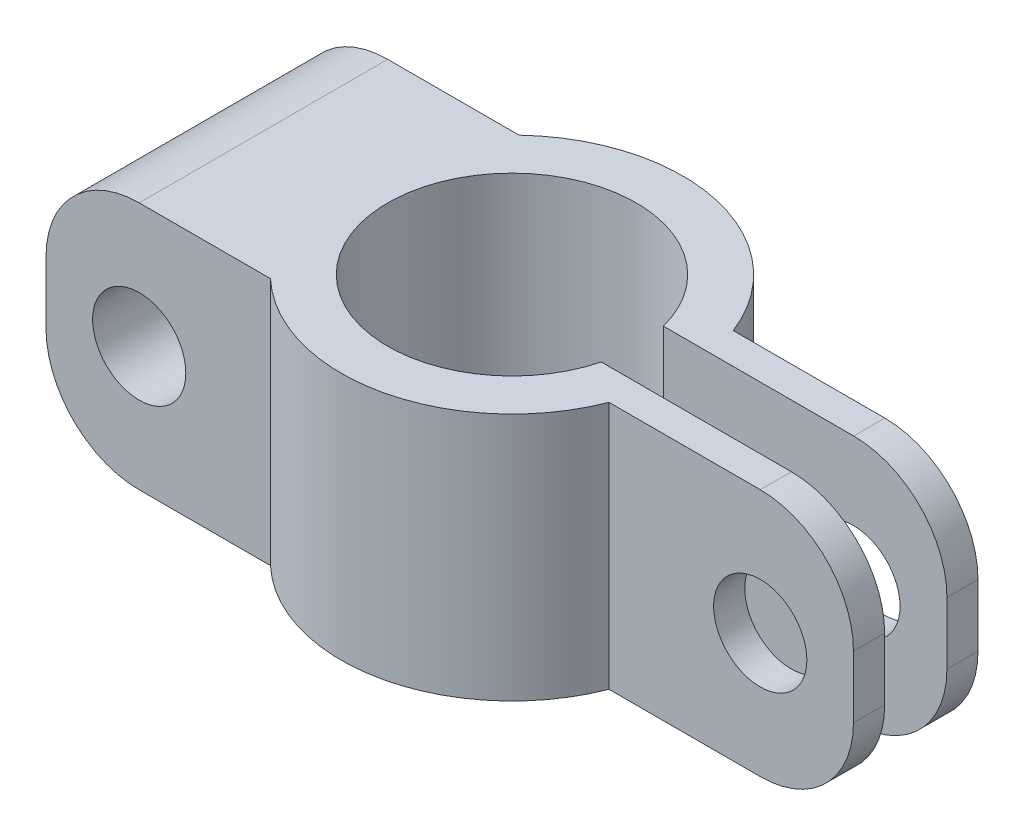
ISO-10303-21;
HEADER;
FILE_DESCRIPTION(('STEP AP214'),'2;1');
FILE_NAME('part.step','',(''),(''),'','','');
FILE_SCHEMA(('AUTOMOTIVE_DESIGN { 1 0 10303 214 1 1 1 1 }'));
ENDSEC;
DATA;
#1=APPLICATION_CONTEXT('core data for automotive mechanical design processes');
#2=APPLICATION_PROTOCOL_DEFINITION('international standard','automotive_design',2000,#1);
#3=PRODUCT_CONTEXT('',#1,'mechanical');
#4=PRODUCT('Part','Part','',(#3));
#5=PRODUCT_RELATED_PRODUCT_CATEGORY('part','',(#4));
#6=PRODUCT_DEFINITION_FORMATION('','',#4);
#7=PRODUCT_DEFINITION_CONTEXT('part definition',#1,'design');
#8=PRODUCT_DEFINITION('design','',#6,#7);
#9=PRODUCT_DEFINITION_SHAPE('','',#8);
#10=(LENGTH_UNIT() NAMED_UNIT(*) SI_UNIT(.MILLI.,.METRE.));
#11=(NAMED_UNIT(*) PLANE_ANGLE_UNIT() SI_UNIT($,.RADIAN.));
#12=(NAMED_UNIT(*) SI_UNIT($,.STERADIAN.) SOLID_ANGLE_UNIT());
#13=UNCERTAINTY_MEASURE_WITH_UNIT(LENGTH_MEASURE(1.E-05),#10,'distance_accuracy_value','');
#14=(GEOMETRIC_REPRESENTATION_CONTEXT(3) GLOBAL_UNCERTAINTY_ASSIGNED_CONTEXT((#13)) GLOBAL_UNIT_ASSIGNED_CONTEXT((#10,
#11,#12)) REPRESENTATION_CONTEXT('',''));
#15=CARTESIAN_POINT('',(0.,0.,0.));
#16=DIRECTION('',(0.,0.,1.));
#17=DIRECTION('',(1.,0.,0.));
#18=AXIS2_PLACEMENT_3D('',#15,#16,#17);
#19=CARTESIAN_POINT('',(0.,8.,0.));
#20=DIRECTION('',(0.,-1.,0.));
#21=DIRECTION('',(0.,0.,-1.));
#22=AXIS2_PLACEMENT_3D('',#19,#20,#21);
#23=CYLINDRICAL_SURFACE('',#22,5.5);
#24=CARTESIAN_POINT('',(0.,0.,0.));
#25=DIRECTION('',(0.,1.,0.));
#26=DIRECTION('',(0.,0.,1.));
#27=AXIS2_PLACEMENT_3D('',#24,#25,#26);
#28=CIRCLE('',#27,5.5);
#29=CARTESIAN_POINT('',(5.1234753829798,0.,-2.));
#30=VERTEX_POINT('',#29);
#31=CARTESIAN_POINT('',(-3.77491721763537,0.,-4.));
#32=VERTEX_POINT('',#31);
#33=EDGE_CURVE('E197',#30,#32,#28,.T.);
#34=ORIENTED_EDGE('',*,*,#33,.T.);
#35=DIRECTION('',(0.,-1.,0.));
#36=VECTOR('',#35,1.);
#37=CARTESIAN_POINT('',(-3.77491721763537,8.,-4.));
#38=LINE('',#37,#36);
#39=CARTESIAN_POINT('',(-3.77491721763537,8.,-4.));
#40=VERTEX_POINT('',#39);
#41=EDGE_CURVE('E174',#40,#32,#38,.T.);
#42=ORIENTED_EDGE('',*,*,#41,.F.);
#43=CARTESIAN_POINT('',(0.,8.,0.));
#44=DIRECTION('',(0.,1.,0.));
#45=DIRECTION('',(0.,0.,1.));
#46=AXIS2_PLACEMENT_3D('',#43,#44,#45);
#47=CIRCLE('',#46,5.5);
#48=CARTESIAN_POINT('',(5.1234753829798,8.,-2.));
#49=VERTEX_POINT('',#48);
#50=EDGE_CURVE('E183',#49,#40,#47,.T.);
#51=ORIENTED_EDGE('',*,*,#50,.F.);
#52=DIRECTION('',(0.,-1.,0.));
#53=VECTOR('',#52,1.);
#54=CARTESIAN_POINT('',(5.1234753829798,8.,-2.));
#55=LINE('',#54,#53);
#56=EDGE_CURVE('E263',#49,#30,#55,.T.);
#57=ORIENTED_EDGE('',*,*,#56,.T.);
#58=EDGE_LOOP('',(#34,#42,#51,#57));
#59=FACE_BOUND('',#58,.T.);
#60=ADVANCED_FACE('F45',(#59),#23,.T.);
#61=CARTESIAN_POINT('',(-3.77491721763537,8.,-4.));
#62=DIRECTION('',(0.,0.,1.));
#63=DIRECTION('',(1.,0.,0.));
#64=AXIS2_PLACEMENT_3D('',#61,#62,#63);
#65=PLANE('',#64);
#66=CARTESIAN_POINT('',(-8.,4.,-4.));
#67=DIRECTION('',(0.,0.,1.));
#68=DIRECTION('',(1.,0.,0.));
#69=AXIS2_PLACEMENT_3D('',#66,#67,#68);
#70=CIRCLE('',#69,1.5);
#71=CARTESIAN_POINT('',(-6.5,4.,-4.));
#72=VERTEX_POINT('',#71);
#73=EDGE_CURVE('E316',#72,#72,#70,.T.);
#74=ORIENTED_EDGE('',*,*,#73,.T.);
#75=EDGE_LOOP('',(#74));
#76=FACE_BOUND('',#75,.T.);
#77=DIRECTION('',(-1.,0.,0.));
#78=VECTOR('',#77,1.);
#79=CARTESIAN_POINT('',(-3.77491721763537,0.,-4.));
#80=LINE('',#79,#78);
#81=CARTESIAN_POINT('',(-8.,0.,-4.));
#82=VERTEX_POINT('',#81);
#83=EDGE_CURVE('E315',#32,#82,#80,.T.);
#84=ORIENTED_EDGE('',*,*,#83,.T.);
#85=CARTESIAN_POINT('',(-8.,3.,-4.));
#86=DIRECTION('',(0.,0.,1.));
#87=DIRECTION('',(1.,0.,0.));
#88=AXIS2_PLACEMENT_3D('',#85,#86,#87);
#89=CIRCLE('',#88,3.);
#90=CARTESIAN_POINT('',(-11.,3.,-4.));
#91=VERTEX_POINT('',#90);
#92=EDGE_CURVE('E219',#82,#91,#89,.F.);
#93=ORIENTED_EDGE('',*,*,#92,.T.);
#94=DIRECTION('',(0.,-1.,0.));
#95=VECTOR('',#94,1.);
#96=CARTESIAN_POINT('',(-11.,8.,-4.));
#97=LINE('',#96,#95);
#98=CARTESIAN_POINT('',(-11.,5.,-4.));
#99=VERTEX_POINT('',#98);
#100=EDGE_CURVE('E199',#99,#91,#97,.T.);
#101=ORIENTED_EDGE('',*,*,#100,.F.);
#102=CARTESIAN_POINT('',(-8.,5.,-4.));
#103=DIRECTION('',(0.,0.,1.));
#104=DIRECTION('',(1.,0.,0.));
#105=AXIS2_PLACEMENT_3D('',#102,#103,#104);
#106=CIRCLE('',#105,3.);
#107=CARTESIAN_POINT('',(-8.,8.,-4.));
#108=VERTEX_POINT('',#107);
#109=EDGE_CURVE('E178',#99,#108,#106,.F.);
#110=ORIENTED_EDGE('',*,*,#109,.T.);
#111=DIRECTION('',(-1.,0.,0.));
#112=VECTOR('',#111,1.);
#113=CARTESIAN_POINT('',(-3.77491721763537,8.,-4.));
#114=LINE('',#113,#112);
#115=EDGE_CURVE('E169',#40,#108,#114,.T.);
#116=ORIENTED_EDGE('',*,*,#115,.F.);
#117=ORIENTED_EDGE('',*,*,#41,.T.);
#118=EDGE_LOOP('',(#84,#93,#101,#110,#116,#117));
#119=FACE_BOUND('',#118,.T.);
#120=ADVANCED_FACE('F172',(#76,#119),#65,.F.);
#121=CARTESIAN_POINT('',(-11.,8.,-4.));
#122=DIRECTION('',(1.,0.,0.));
#123=DIRECTION('',(0.,0.,-1.));
#124=AXIS2_PLACEMENT_3D('',#121,#122,#123);
#125=PLANE('',#124);
#126=ORIENTED_EDGE('',*,*,#100,.T.);
#127=DIRECTION('',(0.,0.,1.));
#128=VECTOR('',#127,1.);
#129=CARTESIAN_POINT('',(-11.,3.,-4.));
#130=LINE('',#129,#128);
#131=CARTESIAN_POINT('',(-11.,3.,4.));
#132=VERTEX_POINT('',#131);
#133=EDGE_CURVE('E212',#91,#132,#130,.T.);
#134=ORIENTED_EDGE('',*,*,#133,.T.);
#135=DIRECTION('',(0.,-1.,0.));
#136=VECTOR('',#135,1.);
#137=CARTESIAN_POINT('',(-11.,8.,4.));
#138=LINE('',#137,#136);
#139=CARTESIAN_POINT('',(-11.,5.,4.));
#140=VERTEX_POINT('',#139);
#141=EDGE_CURVE('E204',#140,#132,#138,.T.);
#142=ORIENTED_EDGE('',*,*,#141,.F.);
#143=DIRECTION('',(0.,0.,1.));
#144=VECTOR('',#143,1.);
#145=CARTESIAN_POINT('',(-11.,5.,-4.));
#146=LINE('',#145,#144);
#147=EDGE_CURVE('E209',#140,#99,#146,.F.);
#148=ORIENTED_EDGE('',*,*,#147,.T.);
#149=EDGE_LOOP('',(#126,#134,#142,#148));
#150=FACE_BOUND('',#149,.T.);
#151=ADVANCED_FACE('F294',(#150),#125,.F.);
#152=CARTESIAN_POINT('',(-11.,8.,4.));
#153=DIRECTION('',(0.,0.,-1.));
#154=DIRECTION('',(-1.,0.,0.));
#155=AXIS2_PLACEMENT_3D('',#152,#153,#154);
#156=PLANE('',#155);
#157=CARTESIAN_POINT('',(-8.,4.,4.));
#158=DIRECTION('',(0.,0.,1.));
#159=DIRECTION('',(1.,0.,0.));
#160=AXIS2_PLACEMENT_3D('',#157,#158,#159);
#161=CIRCLE('',#160,1.5);
#162=CARTESIAN_POINT('',(-6.5,4.,4.));
#163=VERTEX_POINT('',#162);
#164=EDGE_CURVE('E412',#163,#163,#161,.T.);
#165=ORIENTED_EDGE('',*,*,#164,.F.);
#166=EDGE_LOOP('',(#165));
#167=FACE_BOUND('',#166,.T.);
#168=ORIENTED_EDGE('',*,*,#141,.T.);
#169=CARTESIAN_POINT('',(-8.,3.,4.));
#170=DIRECTION('',(0.,0.,-1.));
#171=DIRECTION('',(-1.,0.,0.));
#172=AXIS2_PLACEMENT_3D('',#169,#170,#171);
#173=CIRCLE('',#172,3.);
#174=CARTESIAN_POINT('',(-8.,0.,4.));
#175=VERTEX_POINT('',#174);
#176=EDGE_CURVE('E215',#132,#175,#173,.F.);
#177=ORIENTED_EDGE('',*,*,#176,.T.);
#178=DIRECTION('',(1.,0.,0.));
#179=VECTOR('',#178,1.);
#180=CARTESIAN_POINT('',(-11.,0.,4.));
#181=LINE('',#180,#179);
#182=CARTESIAN_POINT('',(-3.77491721763537,0.,4.));
#183=VERTEX_POINT('',#182);
#184=EDGE_CURVE('E318',#175,#183,#181,.T.);
#185=ORIENTED_EDGE('',*,*,#184,.T.);
#186=DIRECTION('',(0.,-1.,0.));
#187=VECTOR('',#186,1.);
#188=CARTESIAN_POINT('',(-3.77491721763537,8.,4.));
#189=LINE('',#188,#187);
#190=CARTESIAN_POINT('',(-3.77491721763537,8.,4.));
#191=VERTEX_POINT('',#190);
#192=EDGE_CURVE('E284',#191,#183,#189,.T.);
#193=ORIENTED_EDGE('',*,*,#192,.F.);
#194=DIRECTION('',(1.,0.,0.));
#195=VECTOR('',#194,1.);
#196=CARTESIAN_POINT('',(-11.,8.,4.));
#197=LINE('',#196,#195);
#198=CARTESIAN_POINT('',(-8.,8.,4.));
#199=VERTEX_POINT('',#198);
#200=EDGE_CURVE('E182',#199,#191,#197,.T.);
#201=ORIENTED_EDGE('',*,*,#200,.F.);
#202=CARTESIAN_POINT('',(-8.,5.,4.));
#203=DIRECTION('',(0.,0.,-1.));
#204=DIRECTION('',(-1.,0.,0.));
#205=AXIS2_PLACEMENT_3D('',#202,#203,#204);
#206=CIRCLE('',#205,3.);
#207=EDGE_CURVE('E201',#199,#140,#206,.F.);
#208=ORIENTED_EDGE('',*,*,#207,.T.);
#209=EDGE_LOOP('',(#168,#177,#185,#193,#201,#208));
#210=FACE_BOUND('',#209,.T.);
#211=ADVANCED_FACE('F289',(#167,#210),#156,.F.);
#212=CARTESIAN_POINT('',(0.,8.,0.));
#213=DIRECTION('',(0.,-1.,0.));
#214=DIRECTION('',(0.,0.,-1.));
#215=AXIS2_PLACEMENT_3D('',#212,#213,#214);
#216=CYLINDRICAL_SURFACE('',#215,5.5);
#217=CARTESIAN_POINT('',(0.,0.,0.));
#218=DIRECTION('',(0.,1.,0.));
#219=DIRECTION('',(0.,0.,1.));
#220=AXIS2_PLACEMENT_3D('',#217,#218,#219);
#221=CIRCLE('',#220,5.5);
#222=CARTESIAN_POINT('',(5.1234753829798,0.,2.));
#223=VERTEX_POINT('',#222);
#224=EDGE_CURVE('E320',#183,#223,#221,.T.);
#225=ORIENTED_EDGE('',*,*,#224,.T.);
#226=DIRECTION('',(0.,-1.,0.));
#227=VECTOR('',#226,1.);
#228=CARTESIAN_POINT('',(5.1234753829798,8.,2.));
#229=LINE('',#228,#227);
#230=CARTESIAN_POINT('',(5.1234753829798,8.,2.));
#231=VERTEX_POINT('',#230);
#232=EDGE_CURVE('E281',#231,#223,#229,.T.);
#233=ORIENTED_EDGE('',*,*,#232,.F.);
#234=CARTESIAN_POINT('',(0.,8.,0.));
#235=DIRECTION('',(0.,1.,0.));
#236=DIRECTION('',(0.,0.,1.));
#237=AXIS2_PLACEMENT_3D('',#234,#235,#236);
#238=CIRCLE('',#237,5.5);
#239=EDGE_CURVE('E300',#191,#231,#238,.T.);
#240=ORIENTED_EDGE('',*,*,#239,.F.);
#241=ORIENTED_EDGE('',*,*,#192,.T.);
#242=EDGE_LOOP('',(#225,#233,#240,#241));
#243=FACE_BOUND('',#242,.T.);
#244=ADVANCED_FACE('F360',(#243),#216,.T.);
#245=CARTESIAN_POINT('',(5.1234753829798,8.,2.));
#246=DIRECTION('',(0.,0.,-1.));
#247=DIRECTION('',(-1.,0.,0.));
#248=AXIS2_PLACEMENT_3D('',#245,#246,#247);
#249=PLANE('',#248);
#250=CARTESIAN_POINT('',(9.99081745686898,4.,2.));
#251=DIRECTION('',(0.,0.,1.));
#252=DIRECTION('',(1.,0.,0.));
#253=AXIS2_PLACEMENT_3D('',#250,#251,#252);
#254=CIRCLE('',#253,1.5);
#255=CARTESIAN_POINT('',(11.490817456869,4.,2.));
#256=VERTEX_POINT('',#255);
#257=EDGE_CURVE('E408',#256,#256,#254,.T.);
#258=ORIENTED_EDGE('',*,*,#257,.F.);
#259=EDGE_LOOP('',(#258));
#260=FACE_BOUND('',#259,.T.);
#261=DIRECTION('',(1.,0.,0.));
#262=VECTOR('',#261,1.);
#263=CARTESIAN_POINT('',(5.1234753829798,0.,2.));
#264=LINE('',#263,#262);
#265=CARTESIAN_POINT('',(9.99078485701459,0.,2.));
#266=VERTEX_POINT('',#265);
#267=EDGE_CURVE('E322',#223,#266,#264,.T.);
#268=ORIENTED_EDGE('',*,*,#267,.T.);
#269=CARTESIAN_POINT('',(9.99078485701459,3.,2.));
#270=DIRECTION('',(0.,0.,-1.));
#271=DIRECTION('',(1.,0.,0.));
#272=AXIS2_PLACEMENT_3D('',#269,#270,#271);
#273=ELLIPSE('',#272,3.00003259985439,3.);
#274=CARTESIAN_POINT('',(12.990817456869,3.,2.));
#275=VERTEX_POINT('',#274);
#276=EDGE_CURVE('E237',#266,#275,#273,.F.);
#277=ORIENTED_EDGE('',*,*,#276,.T.);
#278=DIRECTION('',(0.,-1.,0.));
#279=VECTOR('',#278,1.);
#280=CARTESIAN_POINT('',(12.990817456869,8.,2.));
#281=LINE('',#280,#279);
#282=CARTESIAN_POINT('',(12.990817456869,5.,2.));
#283=VERTEX_POINT('',#282);
#284=EDGE_CURVE('E278',#283,#275,#281,.T.);
#285=ORIENTED_EDGE('',*,*,#284,.F.);
#286=CARTESIAN_POINT('',(9.99078485701459,5.,2.));
#287=DIRECTION('',(0.,0.,-1.));
#288=DIRECTION('',(-1.,0.,0.));
#289=AXIS2_PLACEMENT_3D('',#286,#287,#288);
#290=ELLIPSE('',#289,3.00003259985439,3.);
#291=CARTESIAN_POINT('',(9.99078485701459,8.,2.));
#292=VERTEX_POINT('',#291);
#293=EDGE_CURVE('E228',#283,#292,#290,.F.);
#294=ORIENTED_EDGE('',*,*,#293,.T.);
#295=DIRECTION('',(1.,0.,0.));
#296=VECTOR('',#295,1.);
#297=CARTESIAN_POINT('',(5.1234753829798,8.,2.));
#298=LINE('',#297,#296);
#299=EDGE_CURVE('E302',#231,#292,#298,.T.);
#300=ORIENTED_EDGE('',*,*,#299,.F.);
#301=ORIENTED_EDGE('',*,*,#232,.T.);
#302=EDGE_LOOP('',(#268,#277,#285,#294,#300,#301));
#303=FACE_BOUND('',#302,.T.);
#304=ADVANCED_FACE('F363',(#260,#303),#249,.F.);
#305=CARTESIAN_POINT('',(12.9954793614523,8.,1.));
#306=DIRECTION('',(-0.999989133499952,0.,-0.00466185392476931));
#307=DIRECTION('',(-0.00466185392476931,0.,0.999989133499952));
#308=AXIS2_PLACEMENT_3D('',#305,#306,#307);
#309=PLANE('',#308);
#310=ORIENTED_EDGE('',*,*,#284,.T.);
#311=DIRECTION('',(0.00466185392476931,0.,-0.999989133499952));
#312=VECTOR('',#311,1.);
#313=CARTESIAN_POINT('',(12.9954793614523,3.,1.));
#314=LINE('',#313,#312);
#315=CARTESIAN_POINT('',(12.9954793614523,3.,1.));
#316=VERTEX_POINT('',#315);
#317=EDGE_CURVE('E230',#275,#316,#314,.T.);
#318=ORIENTED_EDGE('',*,*,#317,.T.);
#319=DIRECTION('',(0.,-1.,0.));
#320=VECTOR('',#319,1.);
#321=CARTESIAN_POINT('',(12.9954793614523,8.,1.));
#322=LINE('',#321,#320);
#323=CARTESIAN_POINT('',(12.9954793614523,5.,1.));
#324=VERTEX_POINT('',#323);
#325=EDGE_CURVE('E275',#324,#316,#322,.T.);
#326=ORIENTED_EDGE('',*,*,#325,.F.);
#327=DIRECTION('',(0.00466185392476931,0.,-0.999989133499952));
#328=VECTOR('',#327,1.);
#329=CARTESIAN_POINT('',(12.990817456869,5.,2.));
#330=LINE('',#329,#328);
#331=EDGE_CURVE('E226',#324,#283,#330,.F.);
#332=ORIENTED_EDGE('',*,*,#331,.T.);
#333=EDGE_LOOP('',(#310,#318,#326,#332));
#334=FACE_BOUND('',#333,.T.);
#335=ADVANCED_FACE('F367',(#334),#309,.F.);
#336=CARTESIAN_POINT('',(5.40832691319598,8.,1.));
#337=DIRECTION('',(0.,0.,1.));
#338=DIRECTION('',(1.,0.,0.));
#339=AXIS2_PLACEMENT_3D('',#336,#337,#338);
#340=PLANE('',#339);
#341=CARTESIAN_POINT('',(9.99081745686898,4.,1.));
#342=DIRECTION('',(0.,0.,1.));
#343=DIRECTION('',(1.,0.,0.));
#344=AXIS2_PLACEMENT_3D('',#341,#342,#343);
#345=CIRCLE('',#344,1.5);
#346=CARTESIAN_POINT('',(11.490817456869,4.,1.));
#347=VERTEX_POINT('',#346);
#348=EDGE_CURVE('E411',#347,#347,#345,.T.);
#349=ORIENTED_EDGE('',*,*,#348,.T.);
#350=EDGE_LOOP('',(#349));
#351=FACE_BOUND('',#350,.T.);
#352=ORIENTED_EDGE('',*,*,#325,.T.);
#353=CARTESIAN_POINT('',(9.99544676159795,3.,0.999999999999999));
#354=DIRECTION('',(0.,0.,1.));
#355=DIRECTION('',(1.,0.,0.));
#356=AXIS2_PLACEMENT_3D('',#353,#354,#355);
#357=ELLIPSE('',#356,3.00003259985439,3.);
#358=CARTESIAN_POINT('',(9.99544676159795,0.,0.999999999999999));
#359=VERTEX_POINT('',#358);
#360=EDGE_CURVE('E233',#316,#359,#357,.F.);
#361=ORIENTED_EDGE('',*,*,#360,.T.);
#362=DIRECTION('',(-1.,0.,0.));
#363=VECTOR('',#362,1.);
#364=CARTESIAN_POINT('',(5.40832691319598,0.,1.));
#365=LINE('',#364,#363);
#366=CARTESIAN_POINT('',(3.87298334620742,0.,1.));
#367=VERTEX_POINT('',#366);
#368=EDGE_CURVE('E325',#359,#367,#365,.T.);
#369=ORIENTED_EDGE('',*,*,#368,.T.);
#370=DIRECTION('',(0.,-1.,0.));
#371=VECTOR('',#370,1.);
#372=CARTESIAN_POINT('',(3.87298334620742,8.,1.));
#373=LINE('',#372,#371);
#374=CARTESIAN_POINT('',(3.87298334620742,8.,1.));
#375=VERTEX_POINT('',#374);
#376=EDGE_CURVE('E272',#375,#367,#373,.T.);
#377=ORIENTED_EDGE('',*,*,#376,.F.);
#378=DIRECTION('',(-1.,0.,0.));
#379=VECTOR('',#378,1.);
#380=CARTESIAN_POINT('',(5.40832691319598,8.,1.));
#381=LINE('',#380,#379);
#382=CARTESIAN_POINT('',(9.99544676159795,8.,1.));
#383=VERTEX_POINT('',#382);
#384=EDGE_CURVE('E307',#383,#375,#381,.T.);
#385=ORIENTED_EDGE('',*,*,#384,.F.);
#386=CARTESIAN_POINT('',(9.99544676159795,5.,0.999999999999999));
#387=DIRECTION('',(0.,0.,1.));
#388=DIRECTION('',(-1.,0.,0.));
#389=AXIS2_PLACEMENT_3D('',#386,#387,#388);
#390=ELLIPSE('',#389,3.00003259985439,3.);
#391=EDGE_CURVE('E224',#383,#324,#390,.F.);
#392=ORIENTED_EDGE('',*,*,#391,.T.);
#393=EDGE_LOOP('',(#352,#361,#369,#377,#385,#392));
#394=FACE_BOUND('',#393,.T.);
#395=ADVANCED_FACE('F371',(#351,#394),#340,.F.);
#396=CARTESIAN_POINT('',(0.,8.,0.));
#397=DIRECTION('',(0.,-1.,0.));
#398=DIRECTION('',(0.,0.,-1.));
#399=AXIS2_PLACEMENT_3D('',#396,#397,#398);
#400=CYLINDRICAL_SURFACE('',#399,4.);
#401=CARTESIAN_POINT('',(0.,0.,0.));
#402=DIRECTION('',(0.,-1.,0.));
#403=DIRECTION('',(0.,0.,1.));
#404=AXIS2_PLACEMENT_3D('',#401,#402,#403);
#405=CIRCLE('',#404,4.);
#406=CARTESIAN_POINT('',(3.87298334620742,0.,-1.));
#407=VERTEX_POINT('',#406);
#408=EDGE_CURVE('E327',#367,#407,#405,.T.);
#409=ORIENTED_EDGE('',*,*,#408,.T.);
#410=DIRECTION('',(0.,-1.,0.));
#411=VECTOR('',#410,1.);
#412=CARTESIAN_POINT('',(3.87298334620742,8.,-1.));
#413=LINE('',#412,#411);
#414=CARTESIAN_POINT('',(3.87298334620742,8.,-1.));
#415=VERTEX_POINT('',#414);
#416=EDGE_CURVE('E265',#415,#407,#413,.T.);
#417=ORIENTED_EDGE('',*,*,#416,.F.);
#418=CARTESIAN_POINT('',(0.,8.,0.));
#419=DIRECTION('',(0.,-1.,0.));
#420=DIRECTION('',(0.,0.,1.));
#421=AXIS2_PLACEMENT_3D('',#418,#419,#420);
#422=CIRCLE('',#421,4.);
#423=EDGE_CURVE('E309',#375,#415,#422,.T.);
#424=ORIENTED_EDGE('',*,*,#423,.F.);
#425=ORIENTED_EDGE('',*,*,#376,.T.);
#426=EDGE_LOOP('',(#409,#417,#424,#425));
#427=FACE_BOUND('',#426,.T.);
#428=ADVANCED_FACE('F375',(#427),#400,.F.);
#429=CARTESIAN_POINT('',(8.93514476794164,8.,-1.));
#430=DIRECTION('',(0.,0.,-1.));
#431=DIRECTION('',(-1.,0.,0.));
#432=AXIS2_PLACEMENT_3D('',#429,#430,#431);
#433=PLANE('',#432);
#434=CARTESIAN_POINT('',(9.99081745686898,4.,-1.));
#435=DIRECTION('',(0.,0.,-1.));
#436=DIRECTION('',(-1.,0.,0.));
#437=AXIS2_PLACEMENT_3D('',#434,#435,#436);
#438=CIRCLE('',#437,1.5);
#439=CARTESIAN_POINT('',(8.49081745686898,4.,-1.));
#440=VERTEX_POINT('',#439);
#441=EDGE_CURVE('E413',#440,#440,#438,.T.);
#442=ORIENTED_EDGE('',*,*,#441,.T.);
#443=EDGE_LOOP('',(#442));
#444=FACE_BOUND('',#443,.T.);
#445=DIRECTION('',(1.,0.,0.));
#446=VECTOR('',#445,1.);
#447=CARTESIAN_POINT('',(8.93514476794164,0.,-1.));
#448=LINE('',#447,#446);
#449=CARTESIAN_POINT('',(10.,0.,-1.));
#450=VERTEX_POINT('',#449);
#451=EDGE_CURVE('E330',#407,#450,#448,.T.);
#452=ORIENTED_EDGE('',*,*,#451,.T.);
#453=CARTESIAN_POINT('',(10.,3.,-1.));
#454=DIRECTION('',(0.,0.,-1.));
#455=DIRECTION('',(-1.,0.,0.));
#456=AXIS2_PLACEMENT_3D('',#453,#454,#455);
#457=CIRCLE('',#456,3.);
#458=CARTESIAN_POINT('',(13.,3.,-1.));
#459=VERTEX_POINT('',#458);
#460=EDGE_CURVE('E11',#450,#459,#457,.F.);
#461=ORIENTED_EDGE('',*,*,#460,.T.);
#462=DIRECTION('',(0.,-1.,0.));
#463=VECTOR('',#462,1.);
#464=CARTESIAN_POINT('',(13.,8.,-1.));
#465=LINE('',#464,#463);
#466=CARTESIAN_POINT('',(13.,5.,-1.));
#467=VERTEX_POINT('',#466);
#468=EDGE_CURVE('E259',#467,#459,#465,.T.);
#469=ORIENTED_EDGE('',*,*,#468,.F.);
#470=CARTESIAN_POINT('',(10.,5.,-1.));
#471=DIRECTION('',(0.,0.,-1.));
#472=DIRECTION('',(-1.,0.,0.));
#473=AXIS2_PLACEMENT_3D('',#470,#471,#472);
#474=CIRCLE('',#473,3.);
#475=CARTESIAN_POINT('',(10.,8.,-1.));
#476=VERTEX_POINT('',#475);
#477=EDGE_CURVE('E245',#467,#476,#474,.F.);
#478=ORIENTED_EDGE('',*,*,#477,.T.);
#479=DIRECTION('',(1.,0.,0.));
#480=VECTOR('',#479,1.);
#481=CARTESIAN_POINT('',(8.93514476794164,8.,-1.));
#482=LINE('',#481,#480);
#483=EDGE_CURVE('E311',#415,#476,#482,.T.);
#484=ORIENTED_EDGE('',*,*,#483,.F.);
#485=ORIENTED_EDGE('',*,*,#416,.T.);
#486=EDGE_LOOP('',(#452,#461,#469,#478,#484,#485));
#487=FACE_BOUND('',#486,.T.);
#488=ADVANCED_FACE('F379',(#444,#487),#433,.F.);
#489=CARTESIAN_POINT('',(13.,8.,-2.));
#490=DIRECTION('',(-1.,0.,0.));
#491=DIRECTION('',(0.,0.,1.));
#492=AXIS2_PLACEMENT_3D('',#489,#490,#491);
#493=PLANE('',#492);
#494=ORIENTED_EDGE('',*,*,#468,.T.);
#495=DIRECTION('',(0.,0.,-1.));
#496=VECTOR('',#495,1.);
#497=CARTESIAN_POINT('',(13.,3.,-2.));
#498=LINE('',#497,#496);
#499=CARTESIAN_POINT('',(13.,3.,-2.));
#500=VERTEX_POINT('',#499);
#501=EDGE_CURVE('E247',#459,#500,#498,.T.);
#502=ORIENTED_EDGE('',*,*,#501,.T.);
#503=DIRECTION('',(0.,-1.,0.));
#504=VECTOR('',#503,1.);
#505=CARTESIAN_POINT('',(13.,8.,-2.));
#506=LINE('',#505,#504);
#507=CARTESIAN_POINT('',(13.,5.,-2.));
#508=VERTEX_POINT('',#507);
#509=EDGE_CURVE('E256',#508,#500,#506,.T.);
#510=ORIENTED_EDGE('',*,*,#509,.F.);
#511=DIRECTION('',(0.,0.,-1.));
#512=VECTOR('',#511,1.);
#513=CARTESIAN_POINT('',(13.,5.,-1.));
#514=LINE('',#513,#512);
#515=EDGE_CURVE('E243',#508,#467,#514,.F.);
#516=ORIENTED_EDGE('',*,*,#515,.T.);
#517=EDGE_LOOP('',(#494,#502,#510,#516));
#518=FACE_BOUND('',#517,.T.);
#519=ADVANCED_FACE('F255',(#518),#493,.F.);
#520=CARTESIAN_POINT('',(5.1234753829798,8.,-2.));
#521=DIRECTION('',(0.,0.,1.));
#522=DIRECTION('',(1.,0.,0.));
#523=AXIS2_PLACEMENT_3D('',#520,#521,#522);
#524=PLANE('',#523);
#525=CARTESIAN_POINT('',(9.99081745686898,4.,-2.));
#526=DIRECTION('',(0.,0.,1.));
#527=DIRECTION('',(1.,0.,0.));
#528=AXIS2_PLACEMENT_3D('',#525,#526,#527);
#529=CIRCLE('',#528,1.5);
#530=CARTESIAN_POINT('',(11.490817456869,4.,-2.));
#531=VERTEX_POINT('',#530);
#532=EDGE_CURVE('E49',#531,#531,#529,.T.);
#533=ORIENTED_EDGE('',*,*,#532,.T.);
#534=EDGE_LOOP('',(#533));
#535=FACE_BOUND('',#534,.T.);
#536=ORIENTED_EDGE('',*,*,#509,.T.);
#537=CARTESIAN_POINT('',(10.,3.,-2.));
#538=DIRECTION('',(0.,0.,1.));
#539=DIRECTION('',(1.,0.,0.));
#540=AXIS2_PLACEMENT_3D('',#537,#538,#539);
#541=CIRCLE('',#540,3.);
#542=CARTESIAN_POINT('',(10.,0.,-2.));
#543=VERTEX_POINT('',#542);
#544=EDGE_CURVE('E68',#500,#543,#541,.F.);
#545=ORIENTED_EDGE('',*,*,#544,.T.);
#546=DIRECTION('',(-1.,0.,0.));
#547=VECTOR('',#546,1.);
#548=CARTESIAN_POINT('',(5.1234753829798,0.,-2.));
#549=LINE('',#548,#547);
#550=EDGE_CURVE('E194',#543,#30,#549,.T.);
#551=ORIENTED_EDGE('',*,*,#550,.T.);
#552=ORIENTED_EDGE('',*,*,#56,.F.);
#553=DIRECTION('',(-1.,0.,0.));
#554=VECTOR('',#553,1.);
#555=CARTESIAN_POINT('',(5.1234753829798,8.,-2.));
#556=LINE('',#555,#554);
#557=CARTESIAN_POINT('',(10.,8.,-2.));
#558=VERTEX_POINT('',#557);
#559=EDGE_CURVE('E190',#558,#49,#556,.T.);
#560=ORIENTED_EDGE('',*,*,#559,.F.);
#561=CARTESIAN_POINT('',(10.,5.,-2.));
#562=DIRECTION('',(0.,0.,1.));
#563=DIRECTION('',(1.,0.,0.));
#564=AXIS2_PLACEMENT_3D('',#561,#562,#563);
#565=CIRCLE('',#564,3.);
#566=EDGE_CURVE('E241',#558,#508,#565,.F.);
#567=ORIENTED_EDGE('',*,*,#566,.T.);
#568=EDGE_LOOP('',(#536,#545,#551,#552,#560,#567));
#569=FACE_BOUND('',#568,.T.);
#570=ADVANCED_FACE('F262',(#535,#569),#524,.F.);
#571=CARTESIAN_POINT('',(0.,8.,0.));
#572=DIRECTION('',(0.,1.,0.));
#573=DIRECTION('',(0.,0.,1.));
#574=AXIS2_PLACEMENT_3D('',#571,#572,#573);
#575=PLANE('',#574);
#576=ORIENTED_EDGE('',*,*,#483,.T.);
#577=DIRECTION('',(0.,0.,-1.));
#578=VECTOR('',#577,1.);
#579=CARTESIAN_POINT('',(10.,8.,-2.00000000000001));
#580=LINE('',#579,#578);
#581=EDGE_CURVE('E239',#476,#558,#580,.T.);
#582=ORIENTED_EDGE('',*,*,#581,.T.);
#583=ORIENTED_EDGE('',*,*,#559,.T.);
#584=ORIENTED_EDGE('',*,*,#50,.T.);
#585=ORIENTED_EDGE('',*,*,#115,.T.);
#586=DIRECTION('',(0.,0.,1.));
#587=VECTOR('',#586,1.);
#588=CARTESIAN_POINT('',(-8.,8.,4.));
#589=LINE('',#588,#587);
#590=EDGE_CURVE('E198',#108,#199,#589,.T.);
#591=ORIENTED_EDGE('',*,*,#590,.T.);
#592=ORIENTED_EDGE('',*,*,#200,.T.);
#593=ORIENTED_EDGE('',*,*,#239,.T.);
#594=ORIENTED_EDGE('',*,*,#299,.T.);
#595=DIRECTION('',(0.00466185392476931,0.,-0.999989133499952));
#596=VECTOR('',#595,1.);
#597=CARTESIAN_POINT('',(9.99551196095248,8.,0.986014438225692));
#598=LINE('',#597,#596);
#599=EDGE_CURVE('E221',#292,#383,#598,.T.);
#600=ORIENTED_EDGE('',*,*,#599,.T.);
#601=ORIENTED_EDGE('',*,*,#384,.T.);
#602=ORIENTED_EDGE('',*,*,#423,.T.);
#603=EDGE_LOOP('',(#576,#582,#583,#584,#585,#591,#592,#593,#594,#600,#601,#602));
#604=FACE_BOUND('',#603,.T.);
#605=ADVANCED_FACE('F187',(#604),#575,.T.);
#606=CARTESIAN_POINT('',(0.,0.,0.));
#607=DIRECTION('',(0.,1.,0.));
#608=DIRECTION('',(0.,0.,1.));
#609=AXIS2_PLACEMENT_3D('',#606,#607,#608);
#610=PLANE('',#609);
#611=ORIENTED_EDGE('',*,*,#550,.F.);
#612=DIRECTION('',(0.,0.,-1.));
#613=VECTOR('',#612,1.);
#614=CARTESIAN_POINT('',(10.,0.,0.));
#615=LINE('',#614,#613);
#616=EDGE_CURVE('E54',#543,#450,#615,.F.);
#617=ORIENTED_EDGE('',*,*,#616,.T.);
#618=ORIENTED_EDGE('',*,*,#451,.F.);
#619=ORIENTED_EDGE('',*,*,#408,.F.);
#620=ORIENTED_EDGE('',*,*,#368,.F.);
#621=DIRECTION('',(0.00466185392476931,0.,-0.999989133499952));
#622=VECTOR('',#621,1.);
#623=CARTESIAN_POINT('',(9.99989133499952,0.,0.0466185392476931));
#624=LINE('',#623,#622);
#625=EDGE_CURVE('E235',#359,#266,#624,.F.);
#626=ORIENTED_EDGE('',*,*,#625,.T.);
#627=ORIENTED_EDGE('',*,*,#267,.F.);
#628=ORIENTED_EDGE('',*,*,#224,.F.);
#629=ORIENTED_EDGE('',*,*,#184,.F.);
#630=DIRECTION('',(0.,0.,1.));
#631=VECTOR('',#630,1.);
#632=CARTESIAN_POINT('',(-8.,0.,0.));
#633=LINE('',#632,#631);
#634=EDGE_CURVE('E217',#175,#82,#633,.F.);
#635=ORIENTED_EDGE('',*,*,#634,.T.);
#636=ORIENTED_EDGE('',*,*,#83,.F.);
#637=ORIENTED_EDGE('',*,*,#33,.F.);
#638=EDGE_LOOP('',(#611,#617,#618,#619,#620,#626,#627,#628,#629,#635,#636,#637));
#639=FACE_BOUND('',#638,.T.);
#640=ADVANCED_FACE('F331',(#639),#610,.F.);
#641=CARTESIAN_POINT('',(-8.,5.,0.));
#642=DIRECTION('',(0.,0.,-1.));
#643=DIRECTION('',(-1.,0.,0.));
#644=AXIS2_PLACEMENT_3D('',#641,#642,#643);
#645=CYLINDRICAL_SURFACE('',#644,3.);
#646=ORIENTED_EDGE('',*,*,#109,.F.);
#647=ORIENTED_EDGE('',*,*,#147,.F.);
#648=ORIENTED_EDGE('',*,*,#207,.F.);
#649=ORIENTED_EDGE('',*,*,#590,.F.);
#650=EDGE_LOOP('',(#646,#647,#648,#649));
#651=FACE_BOUND('',#650,.T.);
#652=ADVANCED_FACE('F297',(#651),#645,.T.);
#653=CARTESIAN_POINT('',(-8.,3.,-4.));
#654=DIRECTION('',(0.,0.,1.));
#655=DIRECTION('',(1.,0.,0.));
#656=AXIS2_PLACEMENT_3D('',#653,#654,#655);
#657=CYLINDRICAL_SURFACE('',#656,3.);
#658=ORIENTED_EDGE('',*,*,#92,.F.);
#659=ORIENTED_EDGE('',*,*,#634,.F.);
#660=ORIENTED_EDGE('',*,*,#176,.F.);
#661=ORIENTED_EDGE('',*,*,#133,.F.);
#662=EDGE_LOOP('',(#658,#659,#660,#661));
#663=FACE_BOUND('',#662,.T.);
#664=ADVANCED_FACE('F335',(#663),#657,.T.);
#665=CARTESIAN_POINT('',(9.99989133499951,5.,0.0466185392476931));
#666=DIRECTION('',(-0.00466185392476931,0.,0.999989133499952));
#667=DIRECTION('',(0.999989133499952,0.,0.00466185392476931));
#668=AXIS2_PLACEMENT_3D('',#665,#666,#667);
#669=CYLINDRICAL_SURFACE('',#668,3.);
#670=ORIENTED_EDGE('',*,*,#293,.F.);
#671=ORIENTED_EDGE('',*,*,#331,.F.);
#672=ORIENTED_EDGE('',*,*,#391,.F.);
#673=ORIENTED_EDGE('',*,*,#599,.F.);
#674=EDGE_LOOP('',(#670,#671,#672,#673));
#675=FACE_BOUND('',#674,.T.);
#676=ADVANCED_FACE('F337',(#675),#669,.T.);
#677=CARTESIAN_POINT('',(9.99551196095248,3.,0.986014438225692));
#678=DIRECTION('',(0.00466185392476931,0.,-0.999989133499952));
#679=DIRECTION('',(-0.999989133499952,0.,-0.00466185392476931));
#680=AXIS2_PLACEMENT_3D('',#677,#678,#679);
#681=CYLINDRICAL_SURFACE('',#680,3.);
#682=ORIENTED_EDGE('',*,*,#276,.F.);
#683=ORIENTED_EDGE('',*,*,#625,.F.);
#684=ORIENTED_EDGE('',*,*,#360,.F.);
#685=ORIENTED_EDGE('',*,*,#317,.F.);
#686=EDGE_LOOP('',(#682,#683,#684,#685));
#687=FACE_BOUND('',#686,.T.);
#688=ADVANCED_FACE('F343',(#687),#681,.T.);
#689=CARTESIAN_POINT('',(10.,5.,0.));
#690=DIRECTION('',(0.,0.,1.));
#691=DIRECTION('',(1.,0.,0.));
#692=AXIS2_PLACEMENT_3D('',#689,#690,#691);
#693=CYLINDRICAL_SURFACE('',#692,3.);
#694=ORIENTED_EDGE('',*,*,#477,.F.);
#695=ORIENTED_EDGE('',*,*,#515,.F.);
#696=ORIENTED_EDGE('',*,*,#566,.F.);
#697=ORIENTED_EDGE('',*,*,#581,.F.);
#698=EDGE_LOOP('',(#694,#695,#696,#697));
#699=FACE_BOUND('',#698,.T.);
#700=ADVANCED_FACE('F433',(#699),#693,.T.);
#701=CARTESIAN_POINT('',(10.,3.,-2.00000000000001));
#702=DIRECTION('',(0.,0.,-1.));
#703=DIRECTION('',(-1.,0.,0.));
#704=AXIS2_PLACEMENT_3D('',#701,#702,#703);
#705=CYLINDRICAL_SURFACE('',#704,3.);
#706=ORIENTED_EDGE('',*,*,#460,.F.);
#707=ORIENTED_EDGE('',*,*,#616,.F.);
#708=ORIENTED_EDGE('',*,*,#544,.F.);
#709=ORIENTED_EDGE('',*,*,#501,.F.);
#710=EDGE_LOOP('',(#706,#707,#708,#709));
#711=FACE_BOUND('',#710,.T.);
#712=ADVANCED_FACE('F47',(#711),#705,.T.);
#713=CARTESIAN_POINT('',(-8.,4.,-16.));
#714=DIRECTION('',(0.,0.,1.));
#715=DIRECTION('',(1.,0.,0.));
#716=AXIS2_PLACEMENT_3D('',#713,#714,#715);
#717=CYLINDRICAL_SURFACE('',#716,1.5);
#718=ORIENTED_EDGE('',*,*,#164,.T.);
#719=EDGE_LOOP('',(#718));
#720=FACE_BOUND('',#719,.T.);
#721=ORIENTED_EDGE('',*,*,#73,.F.);
#722=EDGE_LOOP('',(#721));
#723=FACE_BOUND('',#722,.T.);
#724=ADVANCED_FACE('F393',(#720,#723),#717,.F.);
#725=CARTESIAN_POINT('',(9.99081745686898,4.,-18.));
#726=DIRECTION('',(0.,0.,1.));
#727=DIRECTION('',(1.,0.,0.));
#728=AXIS2_PLACEMENT_3D('',#725,#726,#727);
#729=CYLINDRICAL_SURFACE('',#728,1.5);
#730=ORIENTED_EDGE('',*,*,#532,.F.);
#731=EDGE_LOOP('',(#730));
#732=FACE_BOUND('',#731,.T.);
#733=ORIENTED_EDGE('',*,*,#441,.F.);
#734=EDGE_LOOP('',(#733));
#735=FACE_BOUND('',#734,.T.);
#736=ADVANCED_FACE('F396',(#732,#735),#729,.F.);
#737=ORIENTED_EDGE('',*,*,#257,.T.);
#738=EDGE_LOOP('',(#737));
#739=FACE_BOUND('',#738,.T.);
#740=ORIENTED_EDGE('',*,*,#348,.F.);
#741=EDGE_LOOP('',(#740));
#742=FACE_BOUND('',#741,.T.);
#743=ADVANCED_FACE('F398',(#739,#742),#729,.F.);
#744=CLOSED_SHELL('',(#60,#120,#151,#211,#244,#304,#335,#395,#428,#488,#519,#570,#605,#640,#652,
#664,#676,#688,#700,#712,#724,#736,#743));
#745=MANIFOLD_SOLID_BREP('B2',#744);
#746=ADVANCED_BREP_SHAPE_REPRESENTATION('',(#18,#745),#14);
#747=SHAPE_DEFINITION_REPRESENTATION(#9,#746);
ENDSEC;
END-ISO-10303-21;
